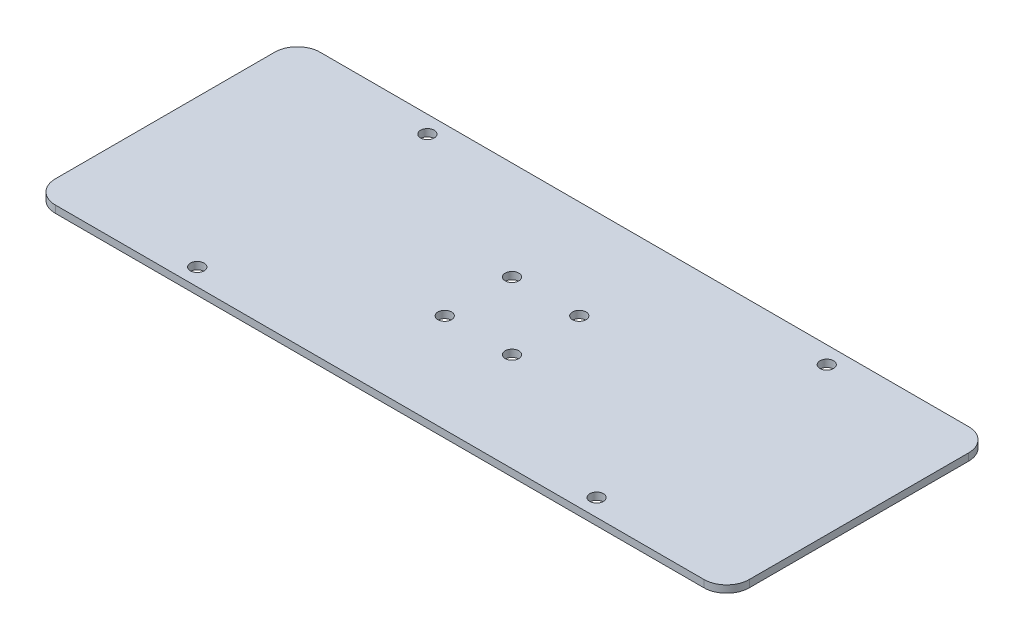
ISO-10303-21;
HEADER;
FILE_DESCRIPTION(('STEP AP214'),'2;1');
FILE_NAME('part.step','',(''),(''),'','','');
FILE_SCHEMA(('AUTOMOTIVE_DESIGN { 1 0 10303 214 1 1 1 1 }'));
ENDSEC;
DATA;
#1=APPLICATION_CONTEXT('core data for automotive mechanical design processes');
#2=APPLICATION_PROTOCOL_DEFINITION('international standard','automotive_design',2000,#1);
#3=PRODUCT_CONTEXT('',#1,'mechanical');
#4=PRODUCT('Part','Part','',(#3));
#5=PRODUCT_RELATED_PRODUCT_CATEGORY('part','',(#4));
#6=PRODUCT_DEFINITION_FORMATION('','',#4);
#7=PRODUCT_DEFINITION_CONTEXT('part definition',#1,'design');
#8=PRODUCT_DEFINITION('design','',#6,#7);
#9=PRODUCT_DEFINITION_SHAPE('','',#8);
#10=(LENGTH_UNIT() NAMED_UNIT(*) SI_UNIT(.MILLI.,.METRE.));
#11=(NAMED_UNIT(*) PLANE_ANGLE_UNIT() SI_UNIT($,.RADIAN.));
#12=(NAMED_UNIT(*) SI_UNIT($,.STERADIAN.) SOLID_ANGLE_UNIT());
#13=UNCERTAINTY_MEASURE_WITH_UNIT(LENGTH_MEASURE(1.E-05),#10,'distance_accuracy_value','');
#14=(GEOMETRIC_REPRESENTATION_CONTEXT(3) GLOBAL_UNCERTAINTY_ASSIGNED_CONTEXT((#13)) GLOBAL_UNIT_ASSIGNED_CONTEXT((#10,
#11,#12)) REPRESENTATION_CONTEXT('',''));
#15=CARTESIAN_POINT('',(0.,0.,0.));
#16=DIRECTION('',(0.,0.,1.));
#17=DIRECTION('',(1.,0.,0.));
#18=AXIS2_PLACEMENT_3D('',#15,#16,#17);
#19=CARTESIAN_POINT('',(-68.0660670421466,1.6,-33.4960191029831));
#20=DIRECTION('',(0.,-1.,0.));
#21=DIRECTION('',(0.,0.,-1.));
#22=AXIS2_PLACEMENT_3D('',#19,#20,#21);
#23=PLANE('',#22);
#24=CARTESIAN_POINT('',(-68.0660670421466,1.6,-33.4960191029831));
#25=DIRECTION('',(0.,1.,0.));
#26=DIRECTION('',(0.,0.,-1.));
#27=AXIS2_PLACEMENT_3D('',#24,#25,#26);
#28=CIRCLE('',#27,5.);
#29=CARTESIAN_POINT('',(-68.0660670421466,1.6,-38.4960191029831));
#30=VERTEX_POINT('',#29);
#31=CARTESIAN_POINT('',(-73.0660670421466,1.6,-33.4960191029831));
#32=VERTEX_POINT('',#31);
#33=EDGE_CURVE('E154',#30,#32,#28,.T.);
#34=ORIENTED_EDGE('',*,*,#33,.T.);
#35=DIRECTION('',(0.,0.,1.));
#36=VECTOR('',#35,1.);
#37=CARTESIAN_POINT('',(-73.0660670421466,1.6,-33.4960191029831));
#38=LINE('',#37,#36);
#39=CARTESIAN_POINT('',(-73.0660670421466,1.6,14.9239808970167));
#40=VERTEX_POINT('',#39);
#41=EDGE_CURVE('E102',#32,#40,#38,.T.);
#42=ORIENTED_EDGE('',*,*,#41,.T.);
#43=CARTESIAN_POINT('',(-68.0660670421466,1.6,14.9239808970169));
#44=DIRECTION('',(0.,1.,0.));
#45=DIRECTION('',(0.,0.,1.));
#46=AXIS2_PLACEMENT_3D('',#43,#44,#45);
#47=CIRCLE('',#46,4.99999999999991);
#48=CARTESIAN_POINT('',(-68.0660670421466,1.6,19.9239808970168));
#49=VERTEX_POINT('',#48);
#50=EDGE_CURVE('E169',#40,#49,#47,.T.);
#51=ORIENTED_EDGE('',*,*,#50,.T.);
#52=DIRECTION('',(1.,0.,0.));
#53=VECTOR('',#52,1.);
#54=CARTESIAN_POINT('',(-68.0660670421466,1.6,19.9239808970167));
#55=LINE('',#54,#53);
#56=CARTESIAN_POINT('',(75.0939329578533,1.6,19.9239808970166));
#57=VERTEX_POINT('',#56);
#58=EDGE_CURVE('E182',#49,#57,#55,.T.);
#59=ORIENTED_EDGE('',*,*,#58,.T.);
#60=CARTESIAN_POINT('',(75.0939329578533,1.6,14.9239808970169));
#61=DIRECTION('',(0.,1.,0.));
#62=DIRECTION('',(0.,0.,1.));
#63=AXIS2_PLACEMENT_3D('',#60,#61,#62);
#64=CIRCLE('',#63,4.99999999999991);
#65=CARTESIAN_POINT('',(80.0939329578532,1.6,14.9239808970167));
#66=VERTEX_POINT('',#65);
#67=EDGE_CURVE('E121',#57,#66,#64,.T.);
#68=ORIENTED_EDGE('',*,*,#67,.T.);
#69=DIRECTION('',(0.,0.,-1.));
#70=VECTOR('',#69,1.);
#71=CARTESIAN_POINT('',(80.0939329578533,1.6,-33.4960191029832));
#72=LINE('',#71,#70);
#73=CARTESIAN_POINT('',(80.0939329578533,1.6,-33.4960191029832));
#74=VERTEX_POINT('',#73);
#75=EDGE_CURVE('E115',#66,#74,#72,.T.);
#76=ORIENTED_EDGE('',*,*,#75,.T.);
#77=CARTESIAN_POINT('',(75.0939329578533,1.6,-33.4960191029831));
#78=DIRECTION('',(0.,1.,0.));
#79=DIRECTION('',(0.,0.,1.));
#80=AXIS2_PLACEMENT_3D('',#77,#78,#79);
#81=CIRCLE('',#80,5.00000000000001);
#82=CARTESIAN_POINT('',(75.0939329578533,1.6,-38.4960191029832));
#83=VERTEX_POINT('',#82);
#84=EDGE_CURVE('E119',#74,#83,#81,.T.);
#85=ORIENTED_EDGE('',*,*,#84,.T.);
#86=DIRECTION('',(-1.,0.,0.));
#87=VECTOR('',#86,1.);
#88=CARTESIAN_POINT('',(-68.0660670421466,1.6,-38.4960191029831));
#89=LINE('',#88,#87);
#90=EDGE_CURVE('E59',#83,#30,#89,.T.);
#91=ORIENTED_EDGE('',*,*,#90,.T.);
#92=EDGE_LOOP('',(#34,#42,#51,#59,#68,#76,#85,#91));
#93=FACE_BOUND('',#92,.T.);
#94=CARTESIAN_POINT('',(-40.5560670421467,1.6,-34.6860191029836));
#95=DIRECTION('',(0.,1.,0.));
#96=DIRECTION('',(0.,0.,1.));
#97=AXIS2_PLACEMENT_3D('',#94,#95,#96);
#98=CIRCLE('',#97,1.49999999999986);
#99=CARTESIAN_POINT('',(-40.5560670421467,1.6,-33.1860191029838));
#100=VERTEX_POINT('',#99);
#101=EDGE_CURVE('E143',#100,#100,#98,.T.);
#102=ORIENTED_EDGE('',*,*,#101,.F.);
#103=EDGE_LOOP('',(#102));
#104=FACE_BOUND('',#103,.T.);
#105=CARTESIAN_POINT('',(-40.5560670421466,1.6,16.1139808970168));
#106=DIRECTION('',(0.,1.,0.));
#107=DIRECTION('',(0.,0.,1.));
#108=AXIS2_PLACEMENT_3D('',#105,#106,#107);
#109=CIRCLE('',#108,1.5);
#110=CARTESIAN_POINT('',(-40.5560670421466,1.6,17.6139808970169));
#111=VERTEX_POINT('',#110);
#112=EDGE_CURVE('E191',#111,#111,#109,.T.);
#113=ORIENTED_EDGE('',*,*,#112,.F.);
#114=EDGE_LOOP('',(#113));
#115=FACE_BOUND('',#114,.T.);
#116=CARTESIAN_POINT('',(47.5839329578534,1.6,-34.6860191029831));
#117=DIRECTION('',(0.,1.,0.));
#118=DIRECTION('',(0.,0.,1.));
#119=AXIS2_PLACEMENT_3D('',#116,#117,#118);
#120=CIRCLE('',#119,1.5);
#121=CARTESIAN_POINT('',(47.5839329578534,1.6,-33.1860191029831));
#122=VERTEX_POINT('',#121);
#123=EDGE_CURVE('E197',#122,#122,#120,.T.);
#124=ORIENTED_EDGE('',*,*,#123,.F.);
#125=EDGE_LOOP('',(#124));
#126=FACE_BOUND('',#125,.T.);
#127=CARTESIAN_POINT('',(47.5839329578534,1.6,16.1139808970168));
#128=DIRECTION('',(0.,1.,0.));
#129=DIRECTION('',(0.,0.,1.));
#130=AXIS2_PLACEMENT_3D('',#127,#128,#129);
#131=CIRCLE('',#130,1.5);
#132=CARTESIAN_POINT('',(47.5839329578534,1.6,17.6139808970169));
#133=VERTEX_POINT('',#132);
#134=EDGE_CURVE('E203',#133,#133,#131,.T.);
#135=ORIENTED_EDGE('',*,*,#134,.F.);
#136=EDGE_LOOP('',(#135));
#137=FACE_BOUND('',#136,.T.);
#138=CARTESIAN_POINT('',(-3.91030942773725,1.6,-16.7110191029833));
#139=DIRECTION('',(0.,1.,0.));
#140=DIRECTION('',(0.,0.,1.));
#141=AXIS2_PLACEMENT_3D('',#138,#139,#140);
#142=CIRCLE('',#141,1.5);
#143=CARTESIAN_POINT('',(-3.91030942773725,1.6,-15.2110191029833));
#144=VERTEX_POINT('',#143);
#145=EDGE_CURVE('E209',#144,#144,#142,.T.);
#146=ORIENTED_EDGE('',*,*,#145,.F.);
#147=EDGE_LOOP('',(#146));
#148=FACE_BOUND('',#147,.T.);
#149=CARTESIAN_POINT('',(10.9396905722627,1.6,-16.7110191029833));
#150=DIRECTION('',(0.,1.,0.));
#151=DIRECTION('',(0.,0.,1.));
#152=AXIS2_PLACEMENT_3D('',#149,#150,#151);
#153=CIRCLE('',#152,1.5);
#154=CARTESIAN_POINT('',(10.9396905722627,1.6,-15.2110191029833));
#155=VERTEX_POINT('',#154);
#156=EDGE_CURVE('E215',#155,#155,#153,.T.);
#157=ORIENTED_EDGE('',*,*,#156,.F.);
#158=EDGE_LOOP('',(#157));
#159=FACE_BOUND('',#158,.T.);
#160=CARTESIAN_POINT('',(-3.91182427006936,1.6,-1.86404948329362));
#161=DIRECTION('',(0.,1.,0.));
#162=DIRECTION('',(0.,0.,1.));
#163=AXIS2_PLACEMENT_3D('',#160,#161,#162);
#164=CIRCLE('',#163,1.5);
#165=CARTESIAN_POINT('',(-3.91182427006936,1.6,-0.364049483293623));
#166=VERTEX_POINT('',#165);
#167=EDGE_CURVE('E221',#166,#166,#164,.T.);
#168=ORIENTED_EDGE('',*,*,#167,.F.);
#169=EDGE_LOOP('',(#168));
#170=FACE_BOUND('',#169,.T.);
#171=CARTESIAN_POINT('',(10.9381754207476,1.6,-1.8610191802791));
#172=DIRECTION('',(0.,1.,0.));
#173=DIRECTION('',(0.,0.,1.));
#174=AXIS2_PLACEMENT_3D('',#171,#172,#173);
#175=CIRCLE('',#174,1.5);
#176=CARTESIAN_POINT('',(10.9381754207476,1.6,-0.361019180279099));
#177=VERTEX_POINT('',#176);
#178=EDGE_CURVE('E227',#177,#177,#175,.T.);
#179=ORIENTED_EDGE('',*,*,#178,.F.);
#180=EDGE_LOOP('',(#179));
#181=FACE_BOUND('',#180,.T.);
#182=ADVANCED_FACE('F42',(#93,#104,#115,#126,#137,#148,#159,#170,#181),#23,.F.);
#183=CARTESIAN_POINT('',(-68.0660670421466,0.,-33.4960191029831));
#184=DIRECTION('',(0.,-1.,0.));
#185=DIRECTION('',(0.,0.,-1.));
#186=AXIS2_PLACEMENT_3D('',#183,#184,#185);
#187=PLANE('',#186);
#188=CARTESIAN_POINT('',(-3.91182427006936,0.,-1.86404948329362));
#189=DIRECTION('',(0.,1.,0.));
#190=DIRECTION('',(0.,0.,1.));
#191=AXIS2_PLACEMENT_3D('',#188,#189,#190);
#192=CIRCLE('',#191,1.5);
#193=CARTESIAN_POINT('',(-3.91182427006936,0.,-0.364049483293623));
#194=VERTEX_POINT('',#193);
#195=EDGE_CURVE('E224',#194,#194,#192,.T.);
#196=ORIENTED_EDGE('',*,*,#195,.T.);
#197=EDGE_LOOP('',(#196));
#198=FACE_BOUND('',#197,.T.);
#199=CARTESIAN_POINT('',(-3.91030942773725,0.,-16.7110191029833));
#200=DIRECTION('',(0.,1.,0.));
#201=DIRECTION('',(0.,0.,1.));
#202=AXIS2_PLACEMENT_3D('',#199,#200,#201);
#203=CIRCLE('',#202,1.5);
#204=CARTESIAN_POINT('',(-3.91030942773725,0.,-15.2110191029833));
#205=VERTEX_POINT('',#204);
#206=EDGE_CURVE('E212',#205,#205,#203,.T.);
#207=ORIENTED_EDGE('',*,*,#206,.T.);
#208=EDGE_LOOP('',(#207));
#209=FACE_BOUND('',#208,.T.);
#210=CARTESIAN_POINT('',(47.5839329578534,0.,-34.6860191029831));
#211=DIRECTION('',(0.,1.,0.));
#212=DIRECTION('',(0.,0.,1.));
#213=AXIS2_PLACEMENT_3D('',#210,#211,#212);
#214=CIRCLE('',#213,1.5);
#215=CARTESIAN_POINT('',(47.5839329578534,0.,-33.1860191029831));
#216=VERTEX_POINT('',#215);
#217=EDGE_CURVE('E200',#216,#216,#214,.T.);
#218=ORIENTED_EDGE('',*,*,#217,.T.);
#219=EDGE_LOOP('',(#218));
#220=FACE_BOUND('',#219,.T.);
#221=CARTESIAN_POINT('',(-40.5560670421467,0.,-34.6860191029836));
#222=DIRECTION('',(0.,1.,0.));
#223=DIRECTION('',(0.,0.,1.));
#224=AXIS2_PLACEMENT_3D('',#221,#222,#223);
#225=CIRCLE('',#224,1.49999999999986);
#226=CARTESIAN_POINT('',(-40.5560670421467,0.,-33.1860191029838));
#227=VERTEX_POINT('',#226);
#228=EDGE_CURVE('E188',#227,#227,#225,.T.);
#229=ORIENTED_EDGE('',*,*,#228,.T.);
#230=EDGE_LOOP('',(#229));
#231=FACE_BOUND('',#230,.T.);
#232=CARTESIAN_POINT('',(-68.0660670421466,0.,-33.4960191029831));
#233=DIRECTION('',(0.,1.,0.));
#234=DIRECTION('',(0.,0.,-1.));
#235=AXIS2_PLACEMENT_3D('',#232,#233,#234);
#236=CIRCLE('',#235,5.);
#237=CARTESIAN_POINT('',(-68.0660670421466,0.,-38.4960191029831));
#238=VERTEX_POINT('',#237);
#239=CARTESIAN_POINT('',(-73.0660670421466,0.,-33.4960191029831));
#240=VERTEX_POINT('',#239);
#241=EDGE_CURVE('E139',#238,#240,#236,.T.);
#242=ORIENTED_EDGE('',*,*,#241,.F.);
#243=DIRECTION('',(-1.,0.,0.));
#244=VECTOR('',#243,1.);
#245=CARTESIAN_POINT('',(-68.0660670421466,0.,-38.4960191029831));
#246=LINE('',#245,#244);
#247=CARTESIAN_POINT('',(75.0939329578533,0.,-38.4960191029832));
#248=VERTEX_POINT('',#247);
#249=EDGE_CURVE('E94',#248,#238,#246,.T.);
#250=ORIENTED_EDGE('',*,*,#249,.F.);
#251=CARTESIAN_POINT('',(75.0939329578533,0.,-33.4960191029831));
#252=DIRECTION('',(0.,1.,0.));
#253=DIRECTION('',(0.,0.,1.));
#254=AXIS2_PLACEMENT_3D('',#251,#252,#253);
#255=CIRCLE('',#254,5.00000000000001);
#256=CARTESIAN_POINT('',(80.0939329578533,0.,-33.4960191029832));
#257=VERTEX_POINT('',#256);
#258=EDGE_CURVE('E88',#257,#248,#255,.T.);
#259=ORIENTED_EDGE('',*,*,#258,.F.);
#260=DIRECTION('',(0.,0.,-1.));
#261=VECTOR('',#260,1.);
#262=CARTESIAN_POINT('',(80.0939329578533,0.,-33.4960191029832));
#263=LINE('',#262,#261);
#264=CARTESIAN_POINT('',(80.0939329578532,0.,14.9239808970167));
#265=VERTEX_POINT('',#264);
#266=EDGE_CURVE('E129',#265,#257,#263,.T.);
#267=ORIENTED_EDGE('',*,*,#266,.F.);
#268=CARTESIAN_POINT('',(75.0939329578533,0.,14.9239808970169));
#269=DIRECTION('',(0.,1.,0.));
#270=DIRECTION('',(0.,0.,1.));
#271=AXIS2_PLACEMENT_3D('',#268,#269,#270);
#272=CIRCLE('',#271,4.99999999999991);
#273=CARTESIAN_POINT('',(75.0939329578533,0.,19.9239808970166));
#274=VERTEX_POINT('',#273);
#275=EDGE_CURVE('E149',#274,#265,#272,.T.);
#276=ORIENTED_EDGE('',*,*,#275,.F.);
#277=DIRECTION('',(1.,0.,0.));
#278=VECTOR('',#277,1.);
#279=CARTESIAN_POINT('',(-68.0660670421466,0.,19.9239808970167));
#280=LINE('',#279,#278);
#281=CARTESIAN_POINT('',(-68.0660670421466,0.,19.9239808970168));
#282=VERTEX_POINT('',#281);
#283=EDGE_CURVE('E147',#282,#274,#280,.T.);
#284=ORIENTED_EDGE('',*,*,#283,.F.);
#285=CARTESIAN_POINT('',(-68.0660670421466,0.,14.9239808970169));
#286=DIRECTION('',(0.,1.,0.));
#287=DIRECTION('',(0.,0.,1.));
#288=AXIS2_PLACEMENT_3D('',#285,#286,#287);
#289=CIRCLE('',#288,4.99999999999991);
#290=CARTESIAN_POINT('',(-73.0660670421466,0.,14.9239808970167));
#291=VERTEX_POINT('',#290);
#292=EDGE_CURVE('E145',#291,#282,#289,.T.);
#293=ORIENTED_EDGE('',*,*,#292,.F.);
#294=DIRECTION('',(0.,0.,1.));
#295=VECTOR('',#294,1.);
#296=CARTESIAN_POINT('',(-73.0660670421466,0.,-33.4960191029831));
#297=LINE('',#296,#295);
#298=EDGE_CURVE('E142',#240,#291,#297,.T.);
#299=ORIENTED_EDGE('',*,*,#298,.F.);
#300=EDGE_LOOP('',(#242,#250,#259,#267,#276,#284,#293,#299));
#301=FACE_BOUND('',#300,.T.);
#302=CARTESIAN_POINT('',(-40.5560670421466,0.,16.1139808970168));
#303=DIRECTION('',(0.,1.,0.));
#304=DIRECTION('',(0.,0.,1.));
#305=AXIS2_PLACEMENT_3D('',#302,#303,#304);
#306=CIRCLE('',#305,1.5);
#307=CARTESIAN_POINT('',(-40.5560670421466,0.,17.6139808970169));
#308=VERTEX_POINT('',#307);
#309=EDGE_CURVE('E194',#308,#308,#306,.T.);
#310=ORIENTED_EDGE('',*,*,#309,.T.);
#311=EDGE_LOOP('',(#310));
#312=FACE_BOUND('',#311,.T.);
#313=CARTESIAN_POINT('',(47.5839329578534,0.,16.1139808970168));
#314=DIRECTION('',(0.,1.,0.));
#315=DIRECTION('',(0.,0.,1.));
#316=AXIS2_PLACEMENT_3D('',#313,#314,#315);
#317=CIRCLE('',#316,1.5);
#318=CARTESIAN_POINT('',(47.5839329578534,0.,17.6139808970169));
#319=VERTEX_POINT('',#318);
#320=EDGE_CURVE('E206',#319,#319,#317,.T.);
#321=ORIENTED_EDGE('',*,*,#320,.T.);
#322=EDGE_LOOP('',(#321));
#323=FACE_BOUND('',#322,.T.);
#324=CARTESIAN_POINT('',(10.9396905722627,0.,-16.7110191029833));
#325=DIRECTION('',(0.,1.,0.));
#326=DIRECTION('',(0.,0.,1.));
#327=AXIS2_PLACEMENT_3D('',#324,#325,#326);
#328=CIRCLE('',#327,1.5);
#329=CARTESIAN_POINT('',(10.9396905722627,0.,-15.2110191029833));
#330=VERTEX_POINT('',#329);
#331=EDGE_CURVE('E218',#330,#330,#328,.T.);
#332=ORIENTED_EDGE('',*,*,#331,.T.);
#333=EDGE_LOOP('',(#332));
#334=FACE_BOUND('',#333,.T.);
#335=CARTESIAN_POINT('',(10.9381754207476,0.,-1.8610191802791));
#336=DIRECTION('',(0.,1.,0.));
#337=DIRECTION('',(0.,0.,1.));
#338=AXIS2_PLACEMENT_3D('',#335,#336,#337);
#339=CIRCLE('',#338,1.5);
#340=CARTESIAN_POINT('',(10.9381754207476,0.,-0.361019180279099));
#341=VERTEX_POINT('',#340);
#342=EDGE_CURVE('E230',#341,#341,#339,.T.);
#343=ORIENTED_EDGE('',*,*,#342,.T.);
#344=EDGE_LOOP('',(#343));
#345=FACE_BOUND('',#344,.T.);
#346=ADVANCED_FACE('F173',(#198,#209,#220,#231,#301,#312,#323,#334,#345),#187,.T.);
#347=CARTESIAN_POINT('',(-68.0660670421466,1.6,-33.4960191029831));
#348=DIRECTION('',(0.,-1.,0.));
#349=DIRECTION('',(0.,0.,-1.));
#350=AXIS2_PLACEMENT_3D('',#347,#348,#349);
#351=CYLINDRICAL_SURFACE('',#350,5.);
#352=ORIENTED_EDGE('',*,*,#241,.T.);
#353=DIRECTION('',(0.,-1.,0.));
#354=VECTOR('',#353,1.);
#355=CARTESIAN_POINT('',(-73.0660670421466,1.6,-33.4960191029831));
#356=LINE('',#355,#354);
#357=EDGE_CURVE('E11',#32,#240,#356,.T.);
#358=ORIENTED_EDGE('',*,*,#357,.F.);
#359=ORIENTED_EDGE('',*,*,#33,.F.);
#360=DIRECTION('',(0.,-1.,0.));
#361=VECTOR('',#360,1.);
#362=CARTESIAN_POINT('',(-68.0660670421466,1.6,-38.4960191029831));
#363=LINE('',#362,#361);
#364=EDGE_CURVE('E135',#30,#238,#363,.T.);
#365=ORIENTED_EDGE('',*,*,#364,.T.);
#366=EDGE_LOOP('',(#352,#358,#359,#365));
#367=FACE_BOUND('',#366,.T.);
#368=ADVANCED_FACE('F44',(#367),#351,.T.);
#369=CARTESIAN_POINT('',(-73.0660670421466,1.6,-33.4960191029831));
#370=DIRECTION('',(1.,0.,0.));
#371=DIRECTION('',(0.,0.,-1.));
#372=AXIS2_PLACEMENT_3D('',#369,#370,#371);
#373=PLANE('',#372);
#374=ORIENTED_EDGE('',*,*,#298,.T.);
#375=DIRECTION('',(0.,-1.,0.));
#376=VECTOR('',#375,1.);
#377=CARTESIAN_POINT('',(-73.0660670421466,1.6,14.9239808970167));
#378=LINE('',#377,#376);
#379=EDGE_CURVE('E51',#40,#291,#378,.T.);
#380=ORIENTED_EDGE('',*,*,#379,.F.);
#381=ORIENTED_EDGE('',*,*,#41,.F.);
#382=ORIENTED_EDGE('',*,*,#357,.T.);
#383=EDGE_LOOP('',(#374,#380,#381,#382));
#384=FACE_BOUND('',#383,.T.);
#385=ADVANCED_FACE('F262',(#384),#373,.F.);
#386=CARTESIAN_POINT('',(-68.0660670421466,1.6,14.9239808970169));
#387=DIRECTION('',(0.,-1.,0.));
#388=DIRECTION('',(0.,0.,-1.));
#389=AXIS2_PLACEMENT_3D('',#386,#387,#388);
#390=CYLINDRICAL_SURFACE('',#389,4.99999999999991);
#391=ORIENTED_EDGE('',*,*,#292,.T.);
#392=DIRECTION('',(0.,-1.,0.));
#393=VECTOR('',#392,1.);
#394=CARTESIAN_POINT('',(-68.0660670421466,1.6,19.9239808970168));
#395=LINE('',#394,#393);
#396=EDGE_CURVE('E161',#49,#282,#395,.T.);
#397=ORIENTED_EDGE('',*,*,#396,.F.);
#398=ORIENTED_EDGE('',*,*,#50,.F.);
#399=ORIENTED_EDGE('',*,*,#379,.T.);
#400=EDGE_LOOP('',(#391,#397,#398,#399));
#401=FACE_BOUND('',#400,.T.);
#402=ADVANCED_FACE('F167',(#401),#390,.T.);
#403=CARTESIAN_POINT('',(-68.0660670421466,1.6,19.9239808970167));
#404=DIRECTION('',(0.,0.,-1.));
#405=DIRECTION('',(-1.,0.,0.));
#406=AXIS2_PLACEMENT_3D('',#403,#404,#405);
#407=PLANE('',#406);
#408=ORIENTED_EDGE('',*,*,#283,.T.);
#409=DIRECTION('',(0.,-1.,0.));
#410=VECTOR('',#409,1.);
#411=CARTESIAN_POINT('',(75.0939329578533,1.6,19.9239808970166));
#412=LINE('',#411,#410);
#413=EDGE_CURVE('E158',#57,#274,#412,.T.);
#414=ORIENTED_EDGE('',*,*,#413,.F.);
#415=ORIENTED_EDGE('',*,*,#58,.F.);
#416=ORIENTED_EDGE('',*,*,#396,.T.);
#417=EDGE_LOOP('',(#408,#414,#415,#416));
#418=FACE_BOUND('',#417,.T.);
#419=ADVANCED_FACE('F178',(#418),#407,.F.);
#420=CARTESIAN_POINT('',(75.0939329578533,1.6,14.9239808970169));
#421=DIRECTION('',(0.,-1.,0.));
#422=DIRECTION('',(0.,0.,-1.));
#423=AXIS2_PLACEMENT_3D('',#420,#421,#422);
#424=CYLINDRICAL_SURFACE('',#423,4.99999999999991);
#425=ORIENTED_EDGE('',*,*,#275,.T.);
#426=DIRECTION('',(0.,-1.,0.));
#427=VECTOR('',#426,1.);
#428=CARTESIAN_POINT('',(80.0939329578532,1.6,14.9239808970167));
#429=LINE('',#428,#427);
#430=EDGE_CURVE('E130',#66,#265,#429,.T.);
#431=ORIENTED_EDGE('',*,*,#430,.F.);
#432=ORIENTED_EDGE('',*,*,#67,.F.);
#433=ORIENTED_EDGE('',*,*,#413,.T.);
#434=EDGE_LOOP('',(#425,#431,#432,#433));
#435=FACE_BOUND('',#434,.T.);
#436=ADVANCED_FACE('F181',(#435),#424,.T.);
#437=CARTESIAN_POINT('',(80.0939329578533,1.6,-33.4960191029832));
#438=DIRECTION('',(-1.,0.,0.));
#439=DIRECTION('',(0.,0.,1.));
#440=AXIS2_PLACEMENT_3D('',#437,#438,#439);
#441=PLANE('',#440);
#442=ORIENTED_EDGE('',*,*,#266,.T.);
#443=DIRECTION('',(0.,-1.,0.));
#444=VECTOR('',#443,1.);
#445=CARTESIAN_POINT('',(80.0939329578533,1.6,-33.4960191029832));
#446=LINE('',#445,#444);
#447=EDGE_CURVE('E126',#74,#257,#446,.T.);
#448=ORIENTED_EDGE('',*,*,#447,.F.);
#449=ORIENTED_EDGE('',*,*,#75,.F.);
#450=ORIENTED_EDGE('',*,*,#430,.T.);
#451=EDGE_LOOP('',(#442,#448,#449,#450));
#452=FACE_BOUND('',#451,.T.);
#453=ADVANCED_FACE('F127',(#452),#441,.F.);
#454=CARTESIAN_POINT('',(75.0939329578533,1.6,-33.4960191029831));
#455=DIRECTION('',(0.,-1.,0.));
#456=DIRECTION('',(0.,0.,-1.));
#457=AXIS2_PLACEMENT_3D('',#454,#455,#456);
#458=CYLINDRICAL_SURFACE('',#457,5.00000000000001);
#459=ORIENTED_EDGE('',*,*,#258,.T.);
#460=DIRECTION('',(0.,-1.,0.));
#461=VECTOR('',#460,1.);
#462=CARTESIAN_POINT('',(75.0939329578533,1.6,-38.4960191029832));
#463=LINE('',#462,#461);
#464=EDGE_CURVE('E131',#83,#248,#463,.T.);
#465=ORIENTED_EDGE('',*,*,#464,.F.);
#466=ORIENTED_EDGE('',*,*,#84,.F.);
#467=ORIENTED_EDGE('',*,*,#447,.T.);
#468=EDGE_LOOP('',(#459,#465,#466,#467));
#469=FACE_BOUND('',#468,.T.);
#470=ADVANCED_FACE('F133',(#469),#458,.T.);
#471=CARTESIAN_POINT('',(-68.0660670421466,1.6,-38.4960191029831));
#472=DIRECTION('',(0.,0.,1.));
#473=DIRECTION('',(1.,0.,0.));
#474=AXIS2_PLACEMENT_3D('',#471,#472,#473);
#475=PLANE('',#474);
#476=ORIENTED_EDGE('',*,*,#249,.T.);
#477=ORIENTED_EDGE('',*,*,#364,.F.);
#478=ORIENTED_EDGE('',*,*,#90,.F.);
#479=ORIENTED_EDGE('',*,*,#464,.T.);
#480=EDGE_LOOP('',(#476,#477,#478,#479));
#481=FACE_BOUND('',#480,.T.);
#482=ADVANCED_FACE('F250',(#481),#475,.F.);
#483=CARTESIAN_POINT('',(-40.5560670421467,1.6,-34.6860191029836));
#484=DIRECTION('',(0.,-1.,0.));
#485=DIRECTION('',(0.,0.,-1.));
#486=AXIS2_PLACEMENT_3D('',#483,#484,#485);
#487=CYLINDRICAL_SURFACE('',#486,1.49999999999986);
#488=ORIENTED_EDGE('',*,*,#101,.T.);
#489=EDGE_LOOP('',(#488));
#490=FACE_BOUND('',#489,.T.);
#491=ORIENTED_EDGE('',*,*,#228,.F.);
#492=EDGE_LOOP('',(#491));
#493=FACE_BOUND('',#492,.T.);
#494=ADVANCED_FACE('F247',(#490,#493),#487,.F.);
#495=CARTESIAN_POINT('',(-40.5560670421466,1.6,16.1139808970168));
#496=DIRECTION('',(0.,-1.,0.));
#497=DIRECTION('',(0.,0.,-1.));
#498=AXIS2_PLACEMENT_3D('',#495,#496,#497);
#499=CYLINDRICAL_SURFACE('',#498,1.5);
#500=ORIENTED_EDGE('',*,*,#112,.T.);
#501=EDGE_LOOP('',(#500));
#502=FACE_BOUND('',#501,.T.);
#503=ORIENTED_EDGE('',*,*,#309,.F.);
#504=EDGE_LOOP('',(#503));
#505=FACE_BOUND('',#504,.T.);
#506=ADVANCED_FACE('F338',(#502,#505),#499,.F.);
#507=CARTESIAN_POINT('',(47.5839329578534,1.6,-34.6860191029831));
#508=DIRECTION('',(0.,-1.,0.));
#509=DIRECTION('',(0.,0.,-1.));
#510=AXIS2_PLACEMENT_3D('',#507,#508,#509);
#511=CYLINDRICAL_SURFACE('',#510,1.5);
#512=ORIENTED_EDGE('',*,*,#123,.T.);
#513=EDGE_LOOP('',(#512));
#514=FACE_BOUND('',#513,.T.);
#515=ORIENTED_EDGE('',*,*,#217,.F.);
#516=EDGE_LOOP('',(#515));
#517=FACE_BOUND('',#516,.T.);
#518=ADVANCED_FACE('F347',(#514,#517),#511,.F.);
#519=CARTESIAN_POINT('',(47.5839329578534,1.6,16.1139808970168));
#520=DIRECTION('',(0.,-1.,0.));
#521=DIRECTION('',(0.,0.,-1.));
#522=AXIS2_PLACEMENT_3D('',#519,#520,#521);
#523=CYLINDRICAL_SURFACE('',#522,1.5);
#524=ORIENTED_EDGE('',*,*,#134,.T.);
#525=EDGE_LOOP('',(#524));
#526=FACE_BOUND('',#525,.T.);
#527=ORIENTED_EDGE('',*,*,#320,.F.);
#528=EDGE_LOOP('',(#527));
#529=FACE_BOUND('',#528,.T.);
#530=ADVANCED_FACE('F356',(#526,#529),#523,.F.);
#531=CARTESIAN_POINT('',(-3.91030942773725,1.6,-16.7110191029833));
#532=DIRECTION('',(0.,-1.,0.));
#533=DIRECTION('',(0.,0.,-1.));
#534=AXIS2_PLACEMENT_3D('',#531,#532,#533);
#535=CYLINDRICAL_SURFACE('',#534,1.5);
#536=ORIENTED_EDGE('',*,*,#145,.T.);
#537=EDGE_LOOP('',(#536));
#538=FACE_BOUND('',#537,.T.);
#539=ORIENTED_EDGE('',*,*,#206,.F.);
#540=EDGE_LOOP('',(#539));
#541=FACE_BOUND('',#540,.T.);
#542=ADVANCED_FACE('F366',(#538,#541),#535,.F.);
#543=CARTESIAN_POINT('',(10.9396905722627,1.6,-16.7110191029833));
#544=DIRECTION('',(0.,-1.,0.));
#545=DIRECTION('',(0.,0.,-1.));
#546=AXIS2_PLACEMENT_3D('',#543,#544,#545);
#547=CYLINDRICAL_SURFACE('',#546,1.5);
#548=ORIENTED_EDGE('',*,*,#156,.T.);
#549=EDGE_LOOP('',(#548));
#550=FACE_BOUND('',#549,.T.);
#551=ORIENTED_EDGE('',*,*,#331,.F.);
#552=EDGE_LOOP('',(#551));
#553=FACE_BOUND('',#552,.T.);
#554=ADVANCED_FACE('F376',(#550,#553),#547,.F.);
#555=CARTESIAN_POINT('',(-3.91182427006936,1.6,-1.86404948329362));
#556=DIRECTION('',(0.,-1.,0.));
#557=DIRECTION('',(0.,0.,-1.));
#558=AXIS2_PLACEMENT_3D('',#555,#556,#557);
#559=CYLINDRICAL_SURFACE('',#558,1.5);
#560=ORIENTED_EDGE('',*,*,#167,.T.);
#561=EDGE_LOOP('',(#560));
#562=FACE_BOUND('',#561,.T.);
#563=ORIENTED_EDGE('',*,*,#195,.F.);
#564=EDGE_LOOP('',(#563));
#565=FACE_BOUND('',#564,.T.);
#566=ADVANCED_FACE('F386',(#562,#565),#559,.F.);
#567=CARTESIAN_POINT('',(10.9381754207476,1.6,-1.8610191802791));
#568=DIRECTION('',(0.,-1.,0.));
#569=DIRECTION('',(0.,0.,-1.));
#570=AXIS2_PLACEMENT_3D('',#567,#568,#569);
#571=CYLINDRICAL_SURFACE('',#570,1.5);
#572=ORIENTED_EDGE('',*,*,#178,.T.);
#573=EDGE_LOOP('',(#572));
#574=FACE_BOUND('',#573,.T.);
#575=ORIENTED_EDGE('',*,*,#342,.F.);
#576=EDGE_LOOP('',(#575));
#577=FACE_BOUND('',#576,.T.);
#578=ADVANCED_FACE('F236',(#574,#577),#571,.F.);
#579=CLOSED_SHELL('',(#182,#346,#368,#385,#402,#419,#436,#453,#470,#482,#494,#506,#518,#530,
#542,#554,#566,#578));
#580=MANIFOLD_SOLID_BREP('B2',#579);
#581=ADVANCED_BREP_SHAPE_REPRESENTATION('',(#18,#580),#14);
#582=SHAPE_DEFINITION_REPRESENTATION(#9,#581);
ENDSEC;
END-ISO-10303-21;
